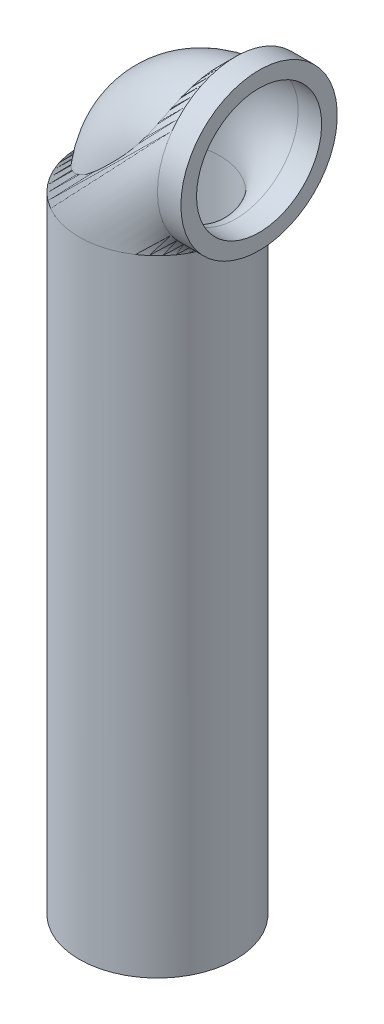
ISO-10303-21;
HEADER;
FILE_DESCRIPTION(('STEP AP214'),'2;1');
FILE_NAME('part.step','',(''),(''),'','','');
FILE_SCHEMA(('AUTOMOTIVE_DESIGN { 1 0 10303 214 1 1 1 1 }'));
ENDSEC;
DATA;
#1=APPLICATION_CONTEXT('core data for automotive mechanical design processes');
#2=APPLICATION_PROTOCOL_DEFINITION('international standard','automotive_design',2000,#1);
#3=PRODUCT_CONTEXT('',#1,'mechanical');
#4=PRODUCT('Part','Part','',(#3));
#5=PRODUCT_RELATED_PRODUCT_CATEGORY('part','',(#4));
#6=PRODUCT_DEFINITION_FORMATION('','',#4);
#7=PRODUCT_DEFINITION_CONTEXT('part definition',#1,'design');
#8=PRODUCT_DEFINITION('design','',#6,#7);
#9=PRODUCT_DEFINITION_SHAPE('','',#8);
#10=(LENGTH_UNIT() NAMED_UNIT(*) SI_UNIT(.MILLI.,.METRE.));
#11=(NAMED_UNIT(*) PLANE_ANGLE_UNIT() SI_UNIT($,.RADIAN.));
#12=(NAMED_UNIT(*) SI_UNIT($,.STERADIAN.) SOLID_ANGLE_UNIT());
#13=UNCERTAINTY_MEASURE_WITH_UNIT(LENGTH_MEASURE(1.E-05),#10,'distance_accuracy_value','');
#14=(GEOMETRIC_REPRESENTATION_CONTEXT(3) GLOBAL_UNCERTAINTY_ASSIGNED_CONTEXT((#13)) GLOBAL_UNIT_ASSIGNED_CONTEXT((#10,
#11,#12)) REPRESENTATION_CONTEXT('',''));
#15=CARTESIAN_POINT('',(0.,0.,0.));
#16=DIRECTION('',(0.,0.,1.));
#17=DIRECTION('',(1.,0.,0.));
#18=AXIS2_PLACEMENT_3D('',#15,#16,#17);
#19=CARTESIAN_POINT('',(12.7,114.3,0.));
#20=DIRECTION('',(1.,0.,0.));
#21=DIRECTION('',(0.,1.,0.));
#22=AXIS2_PLACEMENT_3D('',#19,#20,#21);
#23=CYLINDRICAL_SURFACE('',#22,12.7);
#24=CARTESIAN_POINT('',(16.51,114.3,0.));
#25=DIRECTION('',(1.,0.,0.));
#26=DIRECTION('',(0.,0.,1.));
#27=AXIS2_PLACEMENT_3D('',#24,#25,#26);
#28=CIRCLE('',#27,12.7);
#29=CARTESIAN_POINT('',(16.51,114.3,12.7));
#30=VERTEX_POINT('',#29);
#31=EDGE_CURVE('E11',#30,#30,#28,.T.);
#32=ORIENTED_EDGE('',*,*,#31,.F.);
#33=EDGE_LOOP('',(#32));
#34=FACE_BOUND('',#33,.T.);
#35=CARTESIAN_POINT('',(12.7,114.3,0.));
#36=DIRECTION('',(1.,0.,0.));
#37=DIRECTION('',(0.,0.,1.));
#38=AXIS2_PLACEMENT_3D('',#35,#36,#37);
#39=CIRCLE('',#38,12.7);
#40=CARTESIAN_POINT('',(12.7,101.6,0.));
#41=VERTEX_POINT('',#40);
#42=EDGE_CURVE('E47',#41,#41,#39,.T.);
#43=ORIENTED_EDGE('',*,*,#42,.T.);
#44=EDGE_LOOP('',(#43));
#45=FACE_BOUND('',#44,.T.);
#46=ADVANCED_FACE('F37',(#34,#45),#23,.T.);
#47=CARTESIAN_POINT('',(12.7,114.3,0.));
#48=DIRECTION('',(1.,0.,0.));
#49=DIRECTION('',(0.,1.,0.));
#50=AXIS2_PLACEMENT_3D('',#47,#48,#49);
#51=CYLINDRICAL_SURFACE('',#50,10.16);
#52=CARTESIAN_POINT('',(12.7,114.3,0.));
#53=DIRECTION('',(1.,0.,0.));
#54=DIRECTION('',(0.,0.,1.));
#55=AXIS2_PLACEMENT_3D('',#52,#53,#54);
#56=CIRCLE('',#55,10.16);
#57=CARTESIAN_POINT('',(12.7,124.46,0.));
#58=VERTEX_POINT('',#57);
#59=EDGE_CURVE('E51',#58,#58,#56,.T.);
#60=ORIENTED_EDGE('',*,*,#59,.F.);
#61=EDGE_LOOP('',(#60));
#62=FACE_BOUND('',#61,.T.);
#63=CARTESIAN_POINT('',(16.51,114.3,0.));
#64=DIRECTION('',(1.,0.,0.));
#65=DIRECTION('',(0.,0.,1.));
#66=AXIS2_PLACEMENT_3D('',#63,#64,#65);
#67=CIRCLE('',#66,10.16);
#68=CARTESIAN_POINT('',(16.51,114.3,10.16));
#69=VERTEX_POINT('',#68);
#70=EDGE_CURVE('E43',#69,#69,#67,.T.);
#71=ORIENTED_EDGE('',*,*,#70,.T.);
#72=EDGE_LOOP('',(#71));
#73=FACE_BOUND('',#72,.T.);
#74=ADVANCED_FACE('F71',(#62,#73),#51,.F.);
#75=CARTESIAN_POINT('',(12.7,101.6,0.));
#76=DIRECTION('',(0.,0.,-1.));
#77=DIRECTION('',(-1.,0.,0.));
#78=AXIS2_PLACEMENT_3D('',#75,#76,#77);
#79=DEGENERATE_TOROIDAL_SURFACE('',#78,12.7,12.7,.T.);
#80=CARTESIAN_POINT('',(0.,101.6,0.));
#81=DIRECTION('',(0.,1.,0.));
#82=DIRECTION('',(0.,0.,1.));
#83=AXIS2_PLACEMENT_3D('',#80,#81,#82);
#84=CIRCLE('',#83,12.7);
#85=EDGE_CURVE('E53',#41,#41,#84,.T.);
#86=ORIENTED_EDGE('',*,*,#85,.T.);
#87=ORIENTED_EDGE('',*,*,#42,.F.);
#88=EDGE_LOOP('',(#86,#87));
#89=FACE_BOUND('',#88,.T.);
#90=ADVANCED_FACE('F54',(#89),#79,.T.);
#91=CARTESIAN_POINT('',(12.7,101.6,0.));
#92=DIRECTION('',(0.,0.,-1.));
#93=DIRECTION('',(-1.,0.,0.));
#94=AXIS2_PLACEMENT_3D('',#91,#92,#93);
#95=TOROIDAL_SURFACE('',#94,12.7,10.16);
#96=CARTESIAN_POINT('',(0.,101.6,0.));
#97=DIRECTION('',(0.,1.,0.));
#98=DIRECTION('',(0.,0.,1.));
#99=AXIS2_PLACEMENT_3D('',#96,#97,#98);
#100=CIRCLE('',#99,10.16);
#101=CARTESIAN_POINT('',(-10.16,101.6,0.));
#102=VERTEX_POINT('',#101);
#103=EDGE_CURVE('E56',#102,#102,#100,.T.);
#104=CARTESIAN_POINT('',(12.7,101.6,0.));
#105=DIRECTION('',(0.,0.,-1.));
#106=DIRECTION('',(-1.,0.,0.));
#107=AXIS2_PLACEMENT_3D('',#104,#105,#106);
#108=CIRCLE('',#107,22.86);
#109=EDGE_CURVE('',#102,#58,#108,.T.);
#110=ORIENTED_EDGE('',*,*,#103,.F.);
#111=ORIENTED_EDGE('',*,*,#59,.T.);
#112=ORIENTED_EDGE('',*,*,#109,.T.);
#113=ORIENTED_EDGE('',*,*,#109,.F.);
#114=EDGE_LOOP('',(#110,#112,#111,#113));
#115=FACE_BOUND('',#114,.T.);
#116=ADVANCED_FACE('F89',(#115),#95,.F.);
#117=CARTESIAN_POINT('',(0.,101.6,0.));
#118=DIRECTION('',(0.,-1.,0.));
#119=DIRECTION('',(0.,0.,-1.));
#120=AXIS2_PLACEMENT_3D('',#117,#118,#119);
#121=CYLINDRICAL_SURFACE('',#120,10.16);
#122=ORIENTED_EDGE('',*,*,#103,.T.);
#123=EDGE_LOOP('',(#122));
#124=FACE_BOUND('',#123,.T.);
#125=CARTESIAN_POINT('',(0.,0.,0.));
#126=DIRECTION('',(0.,1.,0.));
#127=DIRECTION('',(0.,0.,1.));
#128=AXIS2_PLACEMENT_3D('',#125,#126,#127);
#129=CIRCLE('',#128,10.16);
#130=CARTESIAN_POINT('',(0.,0.,10.16));
#131=VERTEX_POINT('',#130);
#132=EDGE_CURVE('E64',#131,#131,#129,.T.);
#133=ORIENTED_EDGE('',*,*,#132,.F.);
#134=EDGE_LOOP('',(#133));
#135=FACE_BOUND('',#134,.T.);
#136=ADVANCED_FACE('F95',(#124,#135),#121,.F.);
#137=CARTESIAN_POINT('',(0.,101.6,0.));
#138=DIRECTION('',(0.,-1.,0.));
#139=DIRECTION('',(0.,0.,-1.));
#140=AXIS2_PLACEMENT_3D('',#137,#138,#139);
#141=CYLINDRICAL_SURFACE('',#140,12.7);
#142=ORIENTED_EDGE('',*,*,#85,.F.);
#143=EDGE_LOOP('',(#142));
#144=FACE_BOUND('',#143,.T.);
#145=CARTESIAN_POINT('',(0.,0.,0.));
#146=DIRECTION('',(0.,1.,0.));
#147=DIRECTION('',(0.,0.,1.));
#148=AXIS2_PLACEMENT_3D('',#145,#146,#147);
#149=CIRCLE('',#148,12.7);
#150=CARTESIAN_POINT('',(0.,0.,12.7));
#151=VERTEX_POINT('',#150);
#152=EDGE_CURVE('E61',#151,#151,#149,.T.);
#153=ORIENTED_EDGE('',*,*,#152,.T.);
#154=EDGE_LOOP('',(#153));
#155=FACE_BOUND('',#154,.T.);
#156=ADVANCED_FACE('F77',(#144,#155),#141,.T.);
#157=CARTESIAN_POINT('',(16.51,114.3,0.));
#158=DIRECTION('',(1.,0.,0.));
#159=DIRECTION('',(0.,0.,1.));
#160=AXIS2_PLACEMENT_3D('',#157,#158,#159);
#161=PLANE('',#160);
#162=ORIENTED_EDGE('',*,*,#70,.F.);
#163=EDGE_LOOP('',(#162));
#164=FACE_BOUND('',#163,.T.);
#165=ORIENTED_EDGE('',*,*,#31,.T.);
#166=EDGE_LOOP('',(#165));
#167=FACE_BOUND('',#166,.T.);
#168=ADVANCED_FACE('F73',(#164,#167),#161,.T.);
#169=CARTESIAN_POINT('',(0.,0.,0.));
#170=DIRECTION('',(0.,1.,0.));
#171=DIRECTION('',(0.,0.,1.));
#172=AXIS2_PLACEMENT_3D('',#169,#170,#171);
#173=PLANE('',#172);
#174=ORIENTED_EDGE('',*,*,#132,.T.);
#175=EDGE_LOOP('',(#174));
#176=FACE_BOUND('',#175,.T.);
#177=ORIENTED_EDGE('',*,*,#152,.F.);
#178=EDGE_LOOP('',(#177));
#179=FACE_BOUND('',#178,.T.);
#180=ADVANCED_FACE('F76',(#176,#179),#173,.F.);
#181=CLOSED_SHELL('',(#46,#74,#90,#116,#136,#156,#168,#180));
#182=MANIFOLD_SOLID_BREP('B2',#181);
#183=ADVANCED_BREP_SHAPE_REPRESENTATION('',(#18,#182),#14);
#184=SHAPE_DEFINITION_REPRESENTATION(#9,#183);
ENDSEC;
END-ISO-10303-21;
